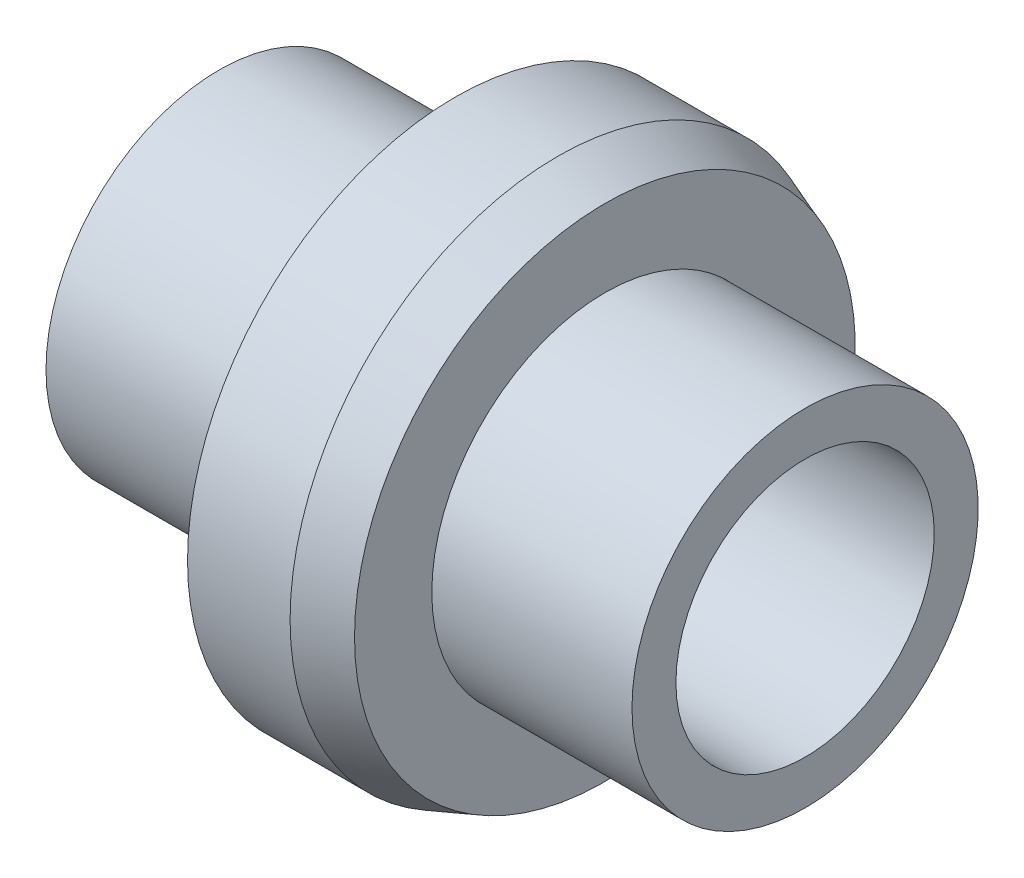
ISO-10303-21;
HEADER;
FILE_DESCRIPTION(('STEP AP214'),'2;1');
FILE_NAME('part.step','',(''),(''),'','','');
FILE_SCHEMA(('AUTOMOTIVE_DESIGN { 1 0 10303 214 1 1 1 1 }'));
ENDSEC;
DATA;
#1=APPLICATION_CONTEXT('core data for automotive mechanical design processes');
#2=APPLICATION_PROTOCOL_DEFINITION('international standard','automotive_design',2000,#1);
#3=PRODUCT_CONTEXT('',#1,'mechanical');
#4=PRODUCT('Part','Part','',(#3));
#5=PRODUCT_RELATED_PRODUCT_CATEGORY('part','',(#4));
#6=PRODUCT_DEFINITION_FORMATION('','',#4);
#7=PRODUCT_DEFINITION_CONTEXT('part definition',#1,'design');
#8=PRODUCT_DEFINITION('design','',#6,#7);
#9=PRODUCT_DEFINITION_SHAPE('','',#8);
#10=(LENGTH_UNIT() NAMED_UNIT(*) SI_UNIT(.MILLI.,.METRE.));
#11=(NAMED_UNIT(*) PLANE_ANGLE_UNIT() SI_UNIT($,.RADIAN.));
#12=(NAMED_UNIT(*) SI_UNIT($,.STERADIAN.) SOLID_ANGLE_UNIT());
#13=UNCERTAINTY_MEASURE_WITH_UNIT(LENGTH_MEASURE(1.E-05),#10,'distance_accuracy_value','');
#14=(GEOMETRIC_REPRESENTATION_CONTEXT(3) GLOBAL_UNCERTAINTY_ASSIGNED_CONTEXT((#13)) GLOBAL_UNIT_ASSIGNED_CONTEXT((#10,
#11,#12)) REPRESENTATION_CONTEXT('',''));
#15=CARTESIAN_POINT('',(0.,0.,0.));
#16=DIRECTION('',(0.,0.,1.));
#17=DIRECTION('',(1.,0.,0.));
#18=AXIS2_PLACEMENT_3D('',#15,#16,#17);
#19=CARTESIAN_POINT('',(-4.07246666666666,-22.9235,0.));
#20=DIRECTION('',(-1.,0.,0.));
#21=DIRECTION('',(0.,0.,1.));
#22=AXIS2_PLACEMENT_3D('',#19,#20,#21);
#23=PLANE('',#22);
#24=CARTESIAN_POINT('',(-4.07246666666666,0.,0.));
#25=DIRECTION('',(-1.,0.,0.));
#26=DIRECTION('',(0.,0.,1.));
#27=AXIS2_PLACEMENT_3D('',#24,#25,#26);
#28=CIRCLE('',#27,24.7777);
#29=CARTESIAN_POINT('',(-4.07246666666666,0.,24.7777));
#30=VERTEX_POINT('',#29);
#31=EDGE_CURVE('E70',#30,#30,#28,.T.);
#32=ORIENTED_EDGE('',*,*,#31,.T.);
#33=EDGE_LOOP('',(#32));
#34=FACE_BOUND('',#33,.T.);
#35=CARTESIAN_POINT('',(-4.07246666666666,0.,0.));
#36=DIRECTION('',(-1.,0.,0.));
#37=DIRECTION('',(0.,0.,1.));
#38=AXIS2_PLACEMENT_3D('',#35,#36,#37);
#39=CIRCLE('',#38,22.9235);
#40=CARTESIAN_POINT('',(-4.07246666666666,0.,22.9235));
#41=VERTEX_POINT('',#40);
#42=EDGE_CURVE('E11',#41,#41,#39,.T.);
#43=ORIENTED_EDGE('',*,*,#42,.F.);
#44=EDGE_LOOP('',(#43));
#45=FACE_BOUND('',#44,.T.);
#46=ADVANCED_FACE('F39',(#34,#45),#23,.T.);
#47=CARTESIAN_POINT('',(-30.48,0.,0.));
#48=DIRECTION('',(-1.,0.,0.));
#49=DIRECTION('',(0.,0.,1.));
#50=AXIS2_PLACEMENT_3D('',#47,#48,#49);
#51=CYLINDRICAL_SURFACE('',#50,22.9235);
#52=ORIENTED_EDGE('',*,*,#42,.T.);
#53=EDGE_LOOP('',(#52));
#54=FACE_BOUND('',#53,.T.);
#55=CARTESIAN_POINT('',(4.74133333333333,0.,0.));
#56=DIRECTION('',(-1.,0.,0.));
#57=DIRECTION('',(0.,0.,1.));
#58=AXIS2_PLACEMENT_3D('',#55,#56,#57);
#59=CIRCLE('',#58,22.9235);
#60=CARTESIAN_POINT('',(4.74133333333333,0.,22.9235));
#61=VERTEX_POINT('',#60);
#62=EDGE_CURVE('E45',#61,#61,#59,.T.);
#63=ORIENTED_EDGE('',*,*,#62,.F.);
#64=EDGE_LOOP('',(#63));
#65=FACE_BOUND('',#64,.T.);
#66=ADVANCED_FACE('F88',(#54,#65),#51,.F.);
#67=CARTESIAN_POINT('',(4.74133333333333,-22.9235,0.));
#68=DIRECTION('',(-1.,0.,0.));
#69=DIRECTION('',(0.,0.,1.));
#70=AXIS2_PLACEMENT_3D('',#67,#68,#69);
#71=PLANE('',#70);
#72=ORIENTED_EDGE('',*,*,#62,.T.);
#73=EDGE_LOOP('',(#72));
#74=FACE_BOUND('',#73,.T.);
#75=CARTESIAN_POINT('',(4.74133333333333,0.,0.));
#76=DIRECTION('',(-1.,0.,0.));
#77=DIRECTION('',(0.,0.,1.));
#78=AXIS2_PLACEMENT_3D('',#75,#76,#77);
#79=CIRCLE('',#78,18.0086);
#80=CARTESIAN_POINT('',(4.74133333333333,0.,18.0086));
#81=VERTEX_POINT('',#80);
#82=EDGE_CURVE('E49',#81,#81,#79,.T.);
#83=ORIENTED_EDGE('',*,*,#82,.F.);
#84=EDGE_LOOP('',(#83));
#85=FACE_BOUND('',#84,.T.);
#86=ADVANCED_FACE('F92',(#74,#85),#71,.T.);
#87=CARTESIAN_POINT('',(-30.48,0.,0.));
#88=DIRECTION('',(-1.,0.,0.));
#89=DIRECTION('',(0.,0.,1.));
#90=AXIS2_PLACEMENT_3D('',#87,#88,#89);
#91=CYLINDRICAL_SURFACE('',#90,18.0086);
#92=ORIENTED_EDGE('',*,*,#82,.T.);
#93=EDGE_LOOP('',(#92));
#94=FACE_BOUND('',#93,.T.);
#95=CARTESIAN_POINT('',(9.65623333333333,0.,0.));
#96=DIRECTION('',(-1.,0.,0.));
#97=DIRECTION('',(0.,0.,1.));
#98=AXIS2_PLACEMENT_3D('',#95,#96,#97);
#99=CIRCLE('',#98,18.0086);
#100=CARTESIAN_POINT('',(9.65623333333333,0.,18.0086));
#101=VERTEX_POINT('',#100);
#102=EDGE_CURVE('E53',#101,#101,#99,.T.);
#103=ORIENTED_EDGE('',*,*,#102,.F.);
#104=EDGE_LOOP('',(#103));
#105=FACE_BOUND('',#104,.T.);
#106=ADVANCED_FACE('F96',(#94,#105),#91,.F.);
#107=CARTESIAN_POINT('',(9.65623333333333,-18.0086,0.));
#108=DIRECTION('',(1.,0.,0.));
#109=DIRECTION('',(0.,0.,-1.));
#110=AXIS2_PLACEMENT_3D('',#107,#108,#109);
#111=PLANE('',#110);
#112=ORIENTED_EDGE('',*,*,#102,.T.);
#113=EDGE_LOOP('',(#112));
#114=FACE_BOUND('',#113,.T.);
#115=CARTESIAN_POINT('',(9.65623333333334,0.,0.));
#116=DIRECTION('',(-1.,0.,0.));
#117=DIRECTION('',(0.,0.,1.));
#118=AXIS2_PLACEMENT_3D('',#115,#116,#117);
#119=CIRCLE('',#118,26.049522695605);
#120=CARTESIAN_POINT('',(9.65623333333334,0.,26.049522695605));
#121=VERTEX_POINT('',#120);
#122=EDGE_CURVE('E58',#121,#121,#119,.T.);
#123=ORIENTED_EDGE('',*,*,#122,.F.);
#124=EDGE_LOOP('',(#123));
#125=FACE_BOUND('',#124,.T.);
#126=ADVANCED_FACE('F102',(#114,#125),#111,.T.);
#127=CARTESIAN_POINT('',(4.74133333333333,0.,0.));
#128=DIRECTION('',(-1.,0.,0.));
#129=DIRECTION('',(0.,0.,1.));
#130=AXIS2_PLACEMENT_3D('',#127,#128,#129);
#131=CONICAL_SURFACE('',#130,27.8384,0.349065850398867);
#132=ORIENTED_EDGE('',*,*,#122,.T.);
#133=EDGE_LOOP('',(#132));
#134=FACE_BOUND('',#133,.T.);
#135=CARTESIAN_POINT('',(4.74133333333333,0.,0.));
#136=DIRECTION('',(-1.,0.,0.));
#137=DIRECTION('',(0.,0.,1.));
#138=AXIS2_PLACEMENT_3D('',#135,#136,#137);
#139=CIRCLE('',#138,27.8384);
#140=CARTESIAN_POINT('',(4.74133333333333,0.,27.8384));
#141=VERTEX_POINT('',#140);
#142=EDGE_CURVE('E61',#141,#141,#139,.T.);
#143=ORIENTED_EDGE('',*,*,#142,.F.);
#144=EDGE_LOOP('',(#143));
#145=FACE_BOUND('',#144,.T.);
#146=ADVANCED_FACE('F106',(#134,#145),#131,.T.);
#147=CARTESIAN_POINT('',(-30.48,0.,0.));
#148=DIRECTION('',(-1.,0.,0.));
#149=DIRECTION('',(0.,0.,1.));
#150=AXIS2_PLACEMENT_3D('',#147,#148,#149);
#151=CYLINDRICAL_SURFACE('',#150,27.8384);
#152=ORIENTED_EDGE('',*,*,#142,.T.);
#153=EDGE_LOOP('',(#152));
#154=FACE_BOUND('',#153,.T.);
#155=CARTESIAN_POINT('',(-5.92666666666666,0.,0.));
#156=DIRECTION('',(-1.,0.,0.));
#157=DIRECTION('',(0.,0.,1.));
#158=AXIS2_PLACEMENT_3D('',#155,#156,#157);
#159=CIRCLE('',#158,27.8384);
#160=CARTESIAN_POINT('',(-5.92666666666666,0.,27.8384));
#161=VERTEX_POINT('',#160);
#162=EDGE_CURVE('E64',#161,#161,#159,.T.);
#163=ORIENTED_EDGE('',*,*,#162,.F.);
#164=EDGE_LOOP('',(#163));
#165=FACE_BOUND('',#164,.T.);
#166=ADVANCED_FACE('F84',(#154,#165),#151,.T.);
#167=CARTESIAN_POINT('',(-5.92666666666666,-24.7777,0.));
#168=DIRECTION('',(-1.,0.,0.));
#169=DIRECTION('',(0.,0.,1.));
#170=AXIS2_PLACEMENT_3D('',#167,#168,#169);
#171=PLANE('',#170);
#172=ORIENTED_EDGE('',*,*,#162,.T.);
#173=EDGE_LOOP('',(#172));
#174=FACE_BOUND('',#173,.T.);
#175=CARTESIAN_POINT('',(-5.92666666666666,0.,0.));
#176=DIRECTION('',(-1.,0.,0.));
#177=DIRECTION('',(0.,0.,1.));
#178=AXIS2_PLACEMENT_3D('',#175,#176,#177);
#179=CIRCLE('',#178,24.7777);
#180=CARTESIAN_POINT('',(-5.92666666666666,0.,24.7777));
#181=VERTEX_POINT('',#180);
#182=EDGE_CURVE('E67',#181,#181,#179,.T.);
#183=ORIENTED_EDGE('',*,*,#182,.F.);
#184=EDGE_LOOP('',(#183));
#185=FACE_BOUND('',#184,.T.);
#186=ADVANCED_FACE('F78',(#174,#185),#171,.T.);
#187=CARTESIAN_POINT('',(-30.48,0.,0.));
#188=DIRECTION('',(-1.,0.,0.));
#189=DIRECTION('',(0.,0.,1.));
#190=AXIS2_PLACEMENT_3D('',#187,#188,#189);
#191=CYLINDRICAL_SURFACE('',#190,24.7777);
#192=ORIENTED_EDGE('',*,*,#182,.T.);
#193=EDGE_LOOP('',(#192));
#194=FACE_BOUND('',#193,.T.);
#195=ORIENTED_EDGE('',*,*,#31,.F.);
#196=EDGE_LOOP('',(#195));
#197=FACE_BOUND('',#196,.T.);
#198=ADVANCED_FACE('F76',(#194,#197),#191,.F.);
#199=CLOSED_SHELL('',(#46,#66,#86,#106,#126,#146,#166,#186,#198));
#200=MANIFOLD_SOLID_BREP('B2',#199);
#201=CARTESIAN_POINT('',(-30.48,0.,0.));
#202=DIRECTION('',(-1.,0.,0.));
#203=DIRECTION('',(0.,0.,1.));
#204=AXIS2_PLACEMENT_3D('',#201,#202,#203);
#205=CYLINDRICAL_SURFACE('',#204,18.0086);
#206=CARTESIAN_POINT('',(4.74133333333333,0.,0.));
#207=DIRECTION('',(1.,0.,0.));
#208=DIRECTION('',(0.,0.,-1.));
#209=AXIS2_PLACEMENT_3D('',#206,#207,#208);
#210=CIRCLE('',#209,18.0086);
#211=CARTESIAN_POINT('',(4.74133333333333,0.,-18.0086));
#212=VERTEX_POINT('',#211);
#213=EDGE_CURVE('E38',#212,#212,#210,.F.);
#214=ORIENTED_EDGE('',*,*,#213,.F.);
#215=EDGE_LOOP('',(#214));
#216=FACE_BOUND('',#215,.T.);
#217=CARTESIAN_POINT('',(30.48,0.,0.));
#218=DIRECTION('',(-1.,0.,0.));
#219=DIRECTION('',(0.,0.,1.));
#220=AXIS2_PLACEMENT_3D('',#217,#218,#219);
#221=CIRCLE('',#220,18.0086);
#222=CARTESIAN_POINT('',(30.48,0.,18.0086));
#223=VERTEX_POINT('',#222);
#224=EDGE_CURVE('E191',#223,#223,#221,.T.);
#225=ORIENTED_EDGE('',*,*,#224,.T.);
#226=EDGE_LOOP('',(#225));
#227=FACE_BOUND('',#226,.T.);
#228=ADVANCED_FACE('F185',(#216,#227),#205,.T.);
#229=CARTESIAN_POINT('',(30.48,-18.0086,0.));
#230=DIRECTION('',(1.,0.,0.));
#231=DIRECTION('',(0.,0.,-1.));
#232=AXIS2_PLACEMENT_3D('',#229,#230,#231);
#233=PLANE('',#232);
#234=CARTESIAN_POINT('',(30.48,0.,0.));
#235=DIRECTION('',(-1.,0.,0.));
#236=DIRECTION('',(0.,0.,1.));
#237=AXIS2_PLACEMENT_3D('',#234,#235,#236);
#238=CIRCLE('',#237,13.4366);
#239=CARTESIAN_POINT('',(30.48,0.,13.4366));
#240=VERTEX_POINT('',#239);
#241=EDGE_CURVE('E195',#240,#240,#238,.T.);
#242=ORIENTED_EDGE('',*,*,#241,.T.);
#243=EDGE_LOOP('',(#242));
#244=FACE_BOUND('',#243,.T.);
#245=ORIENTED_EDGE('',*,*,#224,.F.);
#246=EDGE_LOOP('',(#245));
#247=FACE_BOUND('',#246,.T.);
#248=ADVANCED_FACE('F231',(#244,#247),#233,.T.);
#249=CARTESIAN_POINT('',(30.48,0.,0.));
#250=DIRECTION('',(1.,0.,0.));
#251=DIRECTION('',(0.,0.,-1.));
#252=AXIS2_PLACEMENT_3D('',#249,#250,#251);
#253=CONICAL_SURFACE('',#252,13.4366,0.00566031690706418);
#254=CARTESIAN_POINT('',(3.556,0.,0.));
#255=DIRECTION('',(1.,0.,0.));
#256=DIRECTION('',(0.,0.,-1.));
#257=AXIS2_PLACEMENT_3D('',#254,#255,#256);
#258=CIRCLE('',#257,13.2842);
#259=CARTESIAN_POINT('',(3.556,0.,-13.2842));
#260=VERTEX_POINT('',#259);
#261=EDGE_CURVE('E199',#260,#260,#258,.T.);
#262=ORIENTED_EDGE('',*,*,#261,.F.);
#263=EDGE_LOOP('',(#262));
#264=FACE_BOUND('',#263,.T.);
#265=ORIENTED_EDGE('',*,*,#241,.F.);
#266=EDGE_LOOP('',(#265));
#267=FACE_BOUND('',#266,.T.);
#268=ADVANCED_FACE('F236',(#264,#267),#253,.F.);
#269=CARTESIAN_POINT('',(1.18533333333333,0.,0.));
#270=DIRECTION('',(-1.,0.,0.));
#271=DIRECTION('',(0.,0.,1.));
#272=AXIS2_PLACEMENT_3D('',#269,#270,#271);
#273=CYLINDRICAL_SURFACE('',#272,22.9235);
#274=CARTESIAN_POINT('',(4.74133333333333,0.,0.));
#275=DIRECTION('',(-1.,0.,0.));
#276=DIRECTION('',(0.,0.,1.));
#277=AXIS2_PLACEMENT_3D('',#274,#275,#276);
#278=CIRCLE('',#277,22.9235);
#279=CARTESIAN_POINT('',(4.74133333333333,0.,22.9235));
#280=VERTEX_POINT('',#279);
#281=EDGE_CURVE('E213',#280,#280,#278,.T.);
#282=ORIENTED_EDGE('',*,*,#281,.T.);
#283=EDGE_LOOP('',(#282));
#284=FACE_BOUND('',#283,.T.);
#285=CARTESIAN_POINT('',(1.18533333333333,0.,0.));
#286=DIRECTION('',(-1.,0.,0.));
#287=DIRECTION('',(0.,0.,1.));
#288=AXIS2_PLACEMENT_3D('',#285,#286,#287);
#289=CIRCLE('',#288,22.9235);
#290=CARTESIAN_POINT('',(1.18533333333333,0.,22.9235));
#291=VERTEX_POINT('',#290);
#292=EDGE_CURVE('E204',#291,#291,#289,.T.);
#293=ORIENTED_EDGE('',*,*,#292,.F.);
#294=EDGE_LOOP('',(#293));
#295=FACE_BOUND('',#294,.T.);
#296=ADVANCED_FACE('F217',(#284,#295),#273,.T.);
#297=CARTESIAN_POINT('',(1.18533333333333,-22.9235,0.));
#298=DIRECTION('',(-1.,0.,0.));
#299=DIRECTION('',(0.,0.,1.));
#300=AXIS2_PLACEMENT_3D('',#297,#298,#299);
#301=PLANE('',#300);
#302=ORIENTED_EDGE('',*,*,#292,.T.);
#303=EDGE_LOOP('',(#302));
#304=FACE_BOUND('',#303,.T.);
#305=CARTESIAN_POINT('',(1.18533333333333,0.,0.));
#306=DIRECTION('',(-1.,0.,0.));
#307=DIRECTION('',(0.,0.,1.));
#308=AXIS2_PLACEMENT_3D('',#305,#306,#307);
#309=CIRCLE('',#308,9.4234);
#310=CARTESIAN_POINT('',(1.18533333333333,0.,9.4234));
#311=VERTEX_POINT('',#310);
#312=EDGE_CURVE('E207',#311,#311,#309,.T.);
#313=ORIENTED_EDGE('',*,*,#312,.F.);
#314=EDGE_LOOP('',(#313));
#315=FACE_BOUND('',#314,.T.);
#316=ADVANCED_FACE('F247',(#304,#315),#301,.T.);
#317=CARTESIAN_POINT('',(1.18533333333333,0.,0.));
#318=DIRECTION('',(-1.,0.,0.));
#319=DIRECTION('',(0.,0.,1.));
#320=AXIS2_PLACEMENT_3D('',#317,#318,#319);
#321=CYLINDRICAL_SURFACE('',#320,9.4234);
#322=ORIENTED_EDGE('',*,*,#312,.T.);
#323=EDGE_LOOP('',(#322));
#324=FACE_BOUND('',#323,.T.);
#325=CARTESIAN_POINT('',(3.556,0.,0.));
#326=DIRECTION('',(-1.,0.,0.));
#327=DIRECTION('',(0.,0.,1.));
#328=AXIS2_PLACEMENT_3D('',#325,#326,#327);
#329=CIRCLE('',#328,9.4234);
#330=CARTESIAN_POINT('',(3.556,0.,9.4234));
#331=VERTEX_POINT('',#330);
#332=EDGE_CURVE('E210',#331,#331,#329,.T.);
#333=ORIENTED_EDGE('',*,*,#332,.F.);
#334=EDGE_LOOP('',(#333));
#335=FACE_BOUND('',#334,.T.);
#336=ADVANCED_FACE('F227',(#324,#335),#321,.F.);
#337=CARTESIAN_POINT('',(3.556,-9.4234,0.));
#338=DIRECTION('',(1.,0.,0.));
#339=DIRECTION('',(0.,0.,-1.));
#340=AXIS2_PLACEMENT_3D('',#337,#338,#339);
#341=PLANE('',#340);
#342=ORIENTED_EDGE('',*,*,#261,.T.);
#343=EDGE_LOOP('',(#342));
#344=FACE_BOUND('',#343,.T.);
#345=ORIENTED_EDGE('',*,*,#332,.T.);
#346=EDGE_LOOP('',(#345));
#347=FACE_BOUND('',#346,.T.);
#348=ADVANCED_FACE('F222',(#344,#347),#341,.T.);
#349=CARTESIAN_POINT('',(4.74133333333333,-18.0086,0.));
#350=DIRECTION('',(1.,0.,0.));
#351=DIRECTION('',(0.,0.,-1.));
#352=AXIS2_PLACEMENT_3D('',#349,#350,#351);
#353=PLANE('',#352);
#354=ORIENTED_EDGE('',*,*,#213,.T.);
#355=EDGE_LOOP('',(#354));
#356=FACE_BOUND('',#355,.T.);
#357=ORIENTED_EDGE('',*,*,#281,.F.);
#358=EDGE_LOOP('',(#357));
#359=FACE_BOUND('',#358,.T.);
#360=ADVANCED_FACE('F220',(#356,#359),#353,.T.);
#361=CLOSED_SHELL('',(#228,#248,#268,#296,#316,#336,#348,#360));
#362=MANIFOLD_SOLID_BREP('B6',#361);
#363=CARTESIAN_POINT('',(-30.48,0.,0.));
#364=DIRECTION('',(-1.,0.,0.));
#365=DIRECTION('',(0.,0.,1.));
#366=AXIS2_PLACEMENT_3D('',#363,#364,#365);
#367=CYLINDRICAL_SURFACE('',#366,18.0086);
#368=CARTESIAN_POINT('',(-5.92666666666666,0.,0.));
#369=DIRECTION('',(-1.,0.,0.));
#370=DIRECTION('',(0.,0.,1.));
#371=AXIS2_PLACEMENT_3D('',#368,#369,#370);
#372=CIRCLE('',#371,18.0086);
#373=CARTESIAN_POINT('',(-5.92666666666666,0.,18.0086));
#374=VERTEX_POINT('',#373);
#375=EDGE_CURVE('E184',#374,#374,#372,.F.);
#376=ORIENTED_EDGE('',*,*,#375,.F.);
#377=EDGE_LOOP('',(#376));
#378=FACE_BOUND('',#377,.T.);
#379=CARTESIAN_POINT('',(-30.48,0.,0.));
#380=DIRECTION('',(-1.,0.,0.));
#381=DIRECTION('',(0.,0.,1.));
#382=AXIS2_PLACEMENT_3D('',#379,#380,#381);
#383=CIRCLE('',#382,18.0086);
#384=CARTESIAN_POINT('',(-30.48,0.,18.0086));
#385=VERTEX_POINT('',#384);
#386=EDGE_CURVE('E312',#385,#385,#383,.T.);
#387=ORIENTED_EDGE('',*,*,#386,.F.);
#388=EDGE_LOOP('',(#387));
#389=FACE_BOUND('',#388,.T.);
#390=ADVANCED_FACE('F306',(#378,#389),#367,.T.);
#391=CARTESIAN_POINT('',(-30.48,-18.0086,0.));
#392=DIRECTION('',(-1.,0.,0.));
#393=DIRECTION('',(0.,0.,1.));
#394=AXIS2_PLACEMENT_3D('',#391,#392,#393);
#395=PLANE('',#394);
#396=ORIENTED_EDGE('',*,*,#386,.T.);
#397=EDGE_LOOP('',(#396));
#398=FACE_BOUND('',#397,.T.);
#399=CARTESIAN_POINT('',(-30.48,0.,0.));
#400=DIRECTION('',(-1.,0.,0.));
#401=DIRECTION('',(0.,0.,1.));
#402=AXIS2_PLACEMENT_3D('',#399,#400,#401);
#403=CIRCLE('',#402,13.4366);
#404=CARTESIAN_POINT('',(-30.48,0.,13.4366));
#405=VERTEX_POINT('',#404);
#406=EDGE_CURVE('E316',#405,#405,#403,.T.);
#407=ORIENTED_EDGE('',*,*,#406,.F.);
#408=EDGE_LOOP('',(#407));
#409=FACE_BOUND('',#408,.T.);
#410=ADVANCED_FACE('F354',(#398,#409),#395,.T.);
#411=CARTESIAN_POINT('',(-3.55599999999999,0.,0.));
#412=DIRECTION('',(-1.,0.,0.));
#413=DIRECTION('',(0.,0.,1.));
#414=AXIS2_PLACEMENT_3D('',#411,#412,#413);
#415=CONICAL_SURFACE('',#414,13.2842,0.00566031690706431);
#416=ORIENTED_EDGE('',*,*,#406,.T.);
#417=EDGE_LOOP('',(#416));
#418=FACE_BOUND('',#417,.T.);
#419=CARTESIAN_POINT('',(-3.55599999999999,0.,0.));
#420=DIRECTION('',(-1.,0.,0.));
#421=DIRECTION('',(0.,0.,1.));
#422=AXIS2_PLACEMENT_3D('',#419,#420,#421);
#423=CIRCLE('',#422,13.2842);
#424=CARTESIAN_POINT('',(-3.55599999999999,0.,13.2842));
#425=VERTEX_POINT('',#424);
#426=EDGE_CURVE('E320',#425,#425,#423,.T.);
#427=ORIENTED_EDGE('',*,*,#426,.F.);
#428=EDGE_LOOP('',(#427));
#429=FACE_BOUND('',#428,.T.);
#430=ADVANCED_FACE('F359',(#418,#429),#415,.F.);
#431=CARTESIAN_POINT('',(-3.55599999999999,-9.4234,0.));
#432=DIRECTION('',(-1.,0.,0.));
#433=DIRECTION('',(0.,0.,1.));
#434=AXIS2_PLACEMENT_3D('',#431,#432,#433);
#435=PLANE('',#434);
#436=ORIENTED_EDGE('',*,*,#426,.T.);
#437=EDGE_LOOP('',(#436));
#438=FACE_BOUND('',#437,.T.);
#439=CARTESIAN_POINT('',(-3.55599999999999,0.,0.));
#440=DIRECTION('',(-1.,0.,0.));
#441=DIRECTION('',(0.,0.,1.));
#442=AXIS2_PLACEMENT_3D('',#439,#440,#441);
#443=CIRCLE('',#442,9.4234);
#444=CARTESIAN_POINT('',(-3.55599999999999,0.,9.4234));
#445=VERTEX_POINT('',#444);
#446=EDGE_CURVE('E325',#445,#445,#443,.T.);
#447=ORIENTED_EDGE('',*,*,#446,.F.);
#448=EDGE_LOOP('',(#447));
#449=FACE_BOUND('',#448,.T.);
#450=ADVANCED_FACE('F364',(#438,#449),#435,.T.);
#451=CARTESIAN_POINT('',(-3.556,0.,0.));
#452=DIRECTION('',(-1.,0.,0.));
#453=DIRECTION('',(0.,0.,1.));
#454=AXIS2_PLACEMENT_3D('',#451,#452,#453);
#455=CYLINDRICAL_SURFACE('',#454,9.4234);
#456=ORIENTED_EDGE('',*,*,#446,.T.);
#457=EDGE_LOOP('',(#456));
#458=FACE_BOUND('',#457,.T.);
#459=CARTESIAN_POINT('',(1.18533333333333,0.,0.));
#460=DIRECTION('',(-1.,0.,0.));
#461=DIRECTION('',(0.,0.,1.));
#462=AXIS2_PLACEMENT_3D('',#459,#460,#461);
#463=CIRCLE('',#462,9.4234);
#464=CARTESIAN_POINT('',(1.18533333333333,0.,9.4234));
#465=VERTEX_POINT('',#464);
#466=EDGE_CURVE('E328',#465,#465,#463,.T.);
#467=ORIENTED_EDGE('',*,*,#466,.F.);
#468=EDGE_LOOP('',(#467));
#469=FACE_BOUND('',#468,.T.);
#470=ADVANCED_FACE('F350',(#458,#469),#455,.F.);
#471=CARTESIAN_POINT('',(1.18533333333333,-9.4234,0.));
#472=DIRECTION('',(1.,0.,0.));
#473=DIRECTION('',(0.,0.,-1.));
#474=AXIS2_PLACEMENT_3D('',#471,#472,#473);
#475=PLANE('',#474);
#476=ORIENTED_EDGE('',*,*,#466,.T.);
#477=EDGE_LOOP('',(#476));
#478=FACE_BOUND('',#477,.T.);
#479=CARTESIAN_POINT('',(1.18533333333334,0.,0.));
#480=DIRECTION('',(-1.,0.,0.));
#481=DIRECTION('',(0.,0.,1.));
#482=AXIS2_PLACEMENT_3D('',#479,#480,#481);
#483=CIRCLE('',#482,22.9235);
#484=CARTESIAN_POINT('',(1.18533333333334,0.,22.9235));
#485=VERTEX_POINT('',#484);
#486=EDGE_CURVE('E331',#485,#485,#483,.T.);
#487=ORIENTED_EDGE('',*,*,#486,.F.);
#488=EDGE_LOOP('',(#487));
#489=FACE_BOUND('',#488,.T.);
#490=ADVANCED_FACE('F342',(#478,#489),#475,.T.);
#491=CARTESIAN_POINT('',(-3.556,0.,0.));
#492=DIRECTION('',(-1.,0.,0.));
#493=DIRECTION('',(0.,0.,1.));
#494=AXIS2_PLACEMENT_3D('',#491,#492,#493);
#495=CYLINDRICAL_SURFACE('',#494,22.9235);
#496=ORIENTED_EDGE('',*,*,#486,.T.);
#497=EDGE_LOOP('',(#496));
#498=FACE_BOUND('',#497,.T.);
#499=CARTESIAN_POINT('',(-5.92666666666666,0.,0.));
#500=DIRECTION('',(-1.,0.,0.));
#501=DIRECTION('',(0.,0.,1.));
#502=AXIS2_PLACEMENT_3D('',#499,#500,#501);
#503=CIRCLE('',#502,22.9235);
#504=CARTESIAN_POINT('',(-5.92666666666666,0.,22.9235));
#505=VERTEX_POINT('',#504);
#506=EDGE_CURVE('E334',#505,#505,#503,.T.);
#507=ORIENTED_EDGE('',*,*,#506,.F.);
#508=EDGE_LOOP('',(#507));
#509=FACE_BOUND('',#508,.T.);
#510=ADVANCED_FACE('F340',(#498,#509),#495,.T.);
#511=CARTESIAN_POINT('',(-5.92666666666666,-22.9235,0.));
#512=DIRECTION('',(-1.,0.,0.));
#513=DIRECTION('',(0.,0.,1.));
#514=AXIS2_PLACEMENT_3D('',#511,#512,#513);
#515=PLANE('',#514);
#516=ORIENTED_EDGE('',*,*,#506,.T.);
#517=EDGE_LOOP('',(#516));
#518=FACE_BOUND('',#517,.T.);
#519=ORIENTED_EDGE('',*,*,#375,.T.);
#520=EDGE_LOOP('',(#519));
#521=FACE_BOUND('',#520,.T.);
#522=ADVANCED_FACE('F338',(#518,#521),#515,.T.);
#523=CLOSED_SHELL('',(#390,#410,#430,#450,#470,#490,#510,#522));
#524=MANIFOLD_SOLID_BREP('B33',#523);
#525=ADVANCED_BREP_SHAPE_REPRESENTATION('',(#18,#200,#362,#524),#14);
#526=SHAPE_DEFINITION_REPRESENTATION(#9,#525);
ENDSEC;
END-ISO-10303-21;
